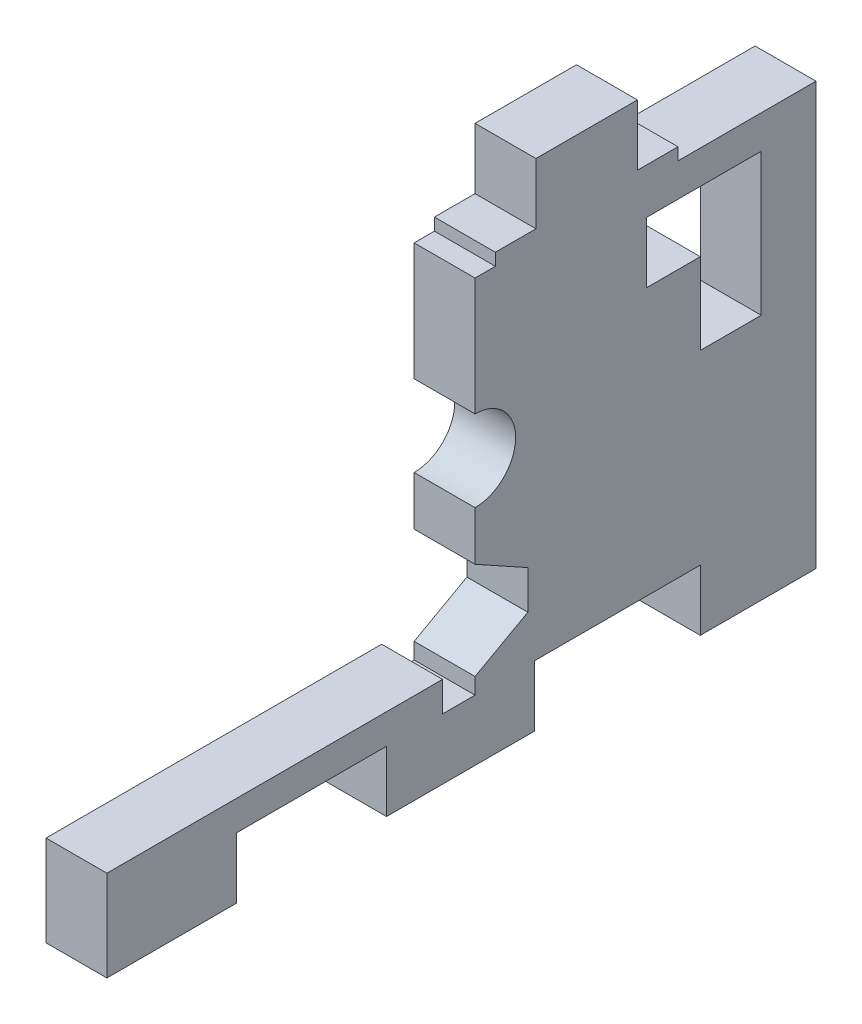
ISO-10303-21;
HEADER;
FILE_DESCRIPTION(('STEP AP214'),'2;1');
FILE_NAME('part.step','',(''),(''),'','','');
FILE_SCHEMA(('AUTOMOTIVE_DESIGN { 1 0 10303 214 1 1 1 1 }'));
ENDSEC;
DATA;
#1=APPLICATION_CONTEXT('core data for automotive mechanical design processes');
#2=APPLICATION_PROTOCOL_DEFINITION('international standard','automotive_design',2000,#1);
#3=PRODUCT_CONTEXT('',#1,'mechanical');
#4=PRODUCT('Part','Part','',(#3));
#5=PRODUCT_RELATED_PRODUCT_CATEGORY('part','',(#4));
#6=PRODUCT_DEFINITION_FORMATION('','',#4);
#7=PRODUCT_DEFINITION_CONTEXT('part definition',#1,'design');
#8=PRODUCT_DEFINITION('design','',#6,#7);
#9=PRODUCT_DEFINITION_SHAPE('','',#8);
#10=(LENGTH_UNIT() NAMED_UNIT(*) SI_UNIT(.MILLI.,.METRE.));
#11=(NAMED_UNIT(*) PLANE_ANGLE_UNIT() SI_UNIT($,.RADIAN.));
#12=(NAMED_UNIT(*) SI_UNIT($,.STERADIAN.) SOLID_ANGLE_UNIT());
#13=UNCERTAINTY_MEASURE_WITH_UNIT(LENGTH_MEASURE(1.E-05),#10,'distance_accuracy_value','');
#14=(GEOMETRIC_REPRESENTATION_CONTEXT(3) GLOBAL_UNCERTAINTY_ASSIGNED_CONTEXT((#13)) GLOBAL_UNIT_ASSIGNED_CONTEXT((#10,
#11,#12)) REPRESENTATION_CONTEXT('',''));
#15=CARTESIAN_POINT('',(0.,0.,0.));
#16=DIRECTION('',(0.,0.,1.));
#17=DIRECTION('',(1.,0.,0.));
#18=AXIS2_PLACEMENT_3D('',#15,#16,#17);
#19=CARTESIAN_POINT('',(64.56,17.8,-16.8));
#20=DIRECTION('',(0.,1.,0.));
#21=DIRECTION('',(0.,0.,1.));
#22=AXIS2_PLACEMENT_3D('',#19,#20,#21);
#23=PLANE('',#22);
#24=DIRECTION('',(0.,0.,-1.));
#25=VECTOR('',#24,1.);
#26=CARTESIAN_POINT('',(61.56,17.8,-16.8));
#27=LINE('',#26,#25);
#28=CARTESIAN_POINT('',(61.56,17.8,-10.));
#29=VERTEX_POINT('',#28);
#30=CARTESIAN_POINT('',(61.56,17.8,-16.8));
#31=VERTEX_POINT('',#30);
#32=EDGE_CURVE('E56',#29,#31,#27,.T.);
#33=ORIENTED_EDGE('',*,*,#32,.F.);
#34=DIRECTION('',(1.,0.,0.));
#35=VECTOR('',#34,1.);
#36=CARTESIAN_POINT('',(51.8667033471579,17.8,-10.));
#37=LINE('',#36,#35);
#38=CARTESIAN_POINT('',(64.56,17.8,-10.));
#39=VERTEX_POINT('',#38);
#40=EDGE_CURVE('E51',#29,#39,#37,.T.);
#41=ORIENTED_EDGE('',*,*,#40,.T.);
#42=DIRECTION('',(0.,0.,-1.));
#43=VECTOR('',#42,1.);
#44=CARTESIAN_POINT('',(64.56,17.8,-16.8));
#45=LINE('',#44,#43);
#46=CARTESIAN_POINT('',(64.56,17.8,-16.8));
#47=VERTEX_POINT('',#46);
#48=EDGE_CURVE('E453',#39,#47,#45,.T.);
#49=ORIENTED_EDGE('',*,*,#48,.T.);
#50=DIRECTION('',(-1.,0.,0.));
#51=VECTOR('',#50,1.);
#52=CARTESIAN_POINT('',(64.56,17.8,-16.8));
#53=LINE('',#52,#51);
#54=EDGE_CURVE('E43',#47,#31,#53,.T.);
#55=ORIENTED_EDGE('',*,*,#54,.T.);
#56=EDGE_LOOP('',(#33,#41,#49,#55));
#57=FACE_BOUND('',#56,.T.);
#58=ADVANCED_FACE('F34',(#57),#23,.T.);
#59=CARTESIAN_POINT('',(64.56,17.8,0.));
#60=DIRECTION('',(0.,0.,1.));
#61=DIRECTION('',(0.,-1.,0.));
#62=AXIS2_PLACEMENT_3D('',#59,#60,#61);
#63=PLANE('',#62);
#64=DIRECTION('',(-1.,0.,0.));
#65=VECTOR('',#64,1.);
#66=CARTESIAN_POINT('',(86.894686100132,0.79664593212668,0.));
#67=LINE('',#66,#65);
#68=CARTESIAN_POINT('',(64.56,0.79664593212668,0.));
#69=VERTEX_POINT('',#68);
#70=CARTESIAN_POINT('',(61.56,0.79664593212668,0.));
#71=VERTEX_POINT('',#70);
#72=EDGE_CURVE('E510',#69,#71,#67,.T.);
#73=ORIENTED_EDGE('',*,*,#72,.T.);
#74=DIRECTION('',(0.,1.,0.));
#75=VECTOR('',#74,1.);
#76=CARTESIAN_POINT('',(61.56,17.8,0.));
#77=LINE('',#76,#75);
#78=CARTESIAN_POINT('',(61.56,0.,0.));
#79=VERTEX_POINT('',#78);
#80=EDGE_CURVE('E410',#79,#71,#77,.T.);
#81=ORIENTED_EDGE('',*,*,#80,.F.);
#82=DIRECTION('',(-1.,0.,0.));
#83=VECTOR('',#82,1.);
#84=CARTESIAN_POINT('',(64.56,0.,0.));
#85=LINE('',#84,#83);
#86=CARTESIAN_POINT('',(64.56,0.,0.));
#87=VERTEX_POINT('',#86);
#88=EDGE_CURVE('E423',#87,#79,#85,.T.);
#89=ORIENTED_EDGE('',*,*,#88,.F.);
#90=DIRECTION('',(0.,1.,0.));
#91=VECTOR('',#90,1.);
#92=CARTESIAN_POINT('',(64.56,17.8,0.));
#93=LINE('',#92,#91);
#94=EDGE_CURVE('E454',#87,#69,#93,.T.);
#95=ORIENTED_EDGE('',*,*,#94,.T.);
#96=EDGE_LOOP('',(#73,#81,#89,#95));
#97=FACE_BOUND('',#96,.T.);
#98=ADVANCED_FACE('F507',(#97),#63,.T.);
#99=DIRECTION('',(-1.,0.,0.));
#100=VECTOR('',#99,1.);
#101=CARTESIAN_POINT('',(86.894686100132,12.,0.));
#102=LINE('',#101,#100);
#103=CARTESIAN_POINT('',(64.56,12.,0.));
#104=VERTEX_POINT('',#103);
#105=CARTESIAN_POINT('',(61.56,12.,0.));
#106=VERTEX_POINT('',#105);
#107=EDGE_CURVE('E537',#104,#106,#102,.T.);
#108=ORIENTED_EDGE('',*,*,#107,.F.);
#109=CARTESIAN_POINT('',(64.56,17.8,0.));
#110=VERTEX_POINT('',#109);
#111=EDGE_CURVE('E581',#104,#110,#93,.T.);
#112=ORIENTED_EDGE('',*,*,#111,.T.);
#113=DIRECTION('',(-1.,0.,0.));
#114=VECTOR('',#113,1.);
#115=CARTESIAN_POINT('',(64.56,17.8,0.));
#116=LINE('',#115,#114);
#117=CARTESIAN_POINT('',(61.56,17.8,0.));
#118=VERTEX_POINT('',#117);
#119=EDGE_CURVE('E421',#110,#118,#116,.T.);
#120=ORIENTED_EDGE('',*,*,#119,.T.);
#121=EDGE_CURVE('E404',#106,#118,#77,.T.);
#122=ORIENTED_EDGE('',*,*,#121,.F.);
#123=EDGE_LOOP('',(#108,#112,#120,#122));
#124=FACE_BOUND('',#123,.T.);
#125=ADVANCED_FACE('F599',(#124),#63,.T.);
#126=CARTESIAN_POINT('',(64.56,0.,-16.8));
#127=DIRECTION('',(0.,0.,-1.));
#128=DIRECTION('',(-1.,0.,0.));
#129=AXIS2_PLACEMENT_3D('',#126,#127,#128);
#130=PLANE('',#129);
#131=DIRECTION('',(0.,-1.,0.));
#132=VECTOR('',#131,1.);
#133=CARTESIAN_POINT('',(61.56,0.,-16.8));
#134=LINE('',#133,#132);
#135=CARTESIAN_POINT('',(61.56,-3.,-16.8));
#136=VERTEX_POINT('',#135);
#137=EDGE_CURVE('E406',#31,#136,#134,.T.);
#138=ORIENTED_EDGE('',*,*,#137,.F.);
#139=ORIENTED_EDGE('',*,*,#54,.F.);
#140=DIRECTION('',(0.,-1.,0.));
#141=VECTOR('',#140,1.);
#142=CARTESIAN_POINT('',(64.56,-3.,-16.8));
#143=LINE('',#142,#141);
#144=CARTESIAN_POINT('',(64.56,-3.,-16.8));
#145=VERTEX_POINT('',#144);
#146=EDGE_CURVE('E408',#47,#145,#143,.T.);
#147=ORIENTED_EDGE('',*,*,#146,.T.);
#148=DIRECTION('',(-1.,0.,0.));
#149=VECTOR('',#148,1.);
#150=CARTESIAN_POINT('',(64.56,-3.,-16.8));
#151=LINE('',#150,#149);
#152=EDGE_CURVE('E448',#145,#136,#151,.T.);
#153=ORIENTED_EDGE('',*,*,#152,.T.);
#154=EDGE_LOOP('',(#138,#139,#147,#153));
#155=FACE_BOUND('',#154,.T.);
#156=ADVANCED_FACE('F601',(#155),#130,.T.);
#157=DIRECTION('',(1.,0.,0.));
#158=VECTOR('',#157,1.);
#159=CARTESIAN_POINT('',(51.8667033471579,17.8,-1.));
#160=LINE('',#159,#158);
#161=CARTESIAN_POINT('',(61.56,17.8,-1.));
#162=VERTEX_POINT('',#161);
#163=CARTESIAN_POINT('',(64.56,17.8,-1.));
#164=VERTEX_POINT('',#163);
#165=EDGE_CURVE('E336',#162,#164,#160,.T.);
#166=ORIENTED_EDGE('',*,*,#165,.F.);
#167=EDGE_CURVE('E400',#118,#162,#27,.T.);
#168=ORIENTED_EDGE('',*,*,#167,.F.);
#169=ORIENTED_EDGE('',*,*,#119,.F.);
#170=EDGE_CURVE('E401',#110,#164,#45,.T.);
#171=ORIENTED_EDGE('',*,*,#170,.T.);
#172=EDGE_LOOP('',(#166,#168,#169,#171));
#173=FACE_BOUND('',#172,.T.);
#174=ADVANCED_FACE('F398',(#173),#23,.T.);
#175=DIRECTION('',(-1.,0.,0.));
#176=VECTOR('',#175,1.);
#177=CARTESIAN_POINT('',(86.894686100132,5.58335406787332,0.));
#178=LINE('',#177,#176);
#179=CARTESIAN_POINT('',(64.56,5.58335406787332,0.));
#180=VERTEX_POINT('',#179);
#181=CARTESIAN_POINT('',(61.56,5.58335406787333,0.));
#182=VERTEX_POINT('',#181);
#183=EDGE_CURVE('E522',#180,#182,#178,.T.);
#184=ORIENTED_EDGE('',*,*,#183,.F.);
#185=CARTESIAN_POINT('',(64.56,8.,0.));
#186=VERTEX_POINT('',#185);
#187=EDGE_CURVE('E584',#180,#186,#93,.T.);
#188=ORIENTED_EDGE('',*,*,#187,.T.);
#189=DIRECTION('',(-1.,0.,0.));
#190=VECTOR('',#189,1.);
#191=CARTESIAN_POINT('',(86.894686100132,8.,0.));
#192=LINE('',#191,#190);
#193=CARTESIAN_POINT('',(61.56,8.,0.));
#194=VERTEX_POINT('',#193);
#195=EDGE_CURVE('E538',#186,#194,#192,.T.);
#196=ORIENTED_EDGE('',*,*,#195,.T.);
#197=EDGE_CURVE('E500',#182,#194,#77,.T.);
#198=ORIENTED_EDGE('',*,*,#197,.F.);
#199=EDGE_LOOP('',(#184,#188,#196,#198));
#200=FACE_BOUND('',#199,.T.);
#201=ADVANCED_FACE('F592',(#200),#63,.T.);
#202=CARTESIAN_POINT('',(64.56,0.,1.6));
#203=DIRECTION('',(0.,1.,0.));
#204=DIRECTION('',(0.,0.,1.));
#205=AXIS2_PLACEMENT_3D('',#202,#203,#204);
#206=PLANE('',#205);
#207=DIRECTION('',(0.,0.,-1.));
#208=VECTOR('',#207,1.);
#209=CARTESIAN_POINT('',(61.56,0.,1.6));
#210=LINE('',#209,#208);
#211=CARTESIAN_POINT('',(61.56,0.,1.6));
#212=VERTEX_POINT('',#211);
#213=EDGE_CURVE('E497',#212,#79,#210,.T.);
#214=ORIENTED_EDGE('',*,*,#213,.F.);
#215=DIRECTION('',(-1.,0.,0.));
#216=VECTOR('',#215,1.);
#217=CARTESIAN_POINT('',(64.56,0.,1.6));
#218=LINE('',#217,#216);
#219=CARTESIAN_POINT('',(64.56,0.,1.6));
#220=VERTEX_POINT('',#219);
#221=EDGE_CURVE('E425',#220,#212,#218,.T.);
#222=ORIENTED_EDGE('',*,*,#221,.F.);
#223=DIRECTION('',(0.,0.,-1.));
#224=VECTOR('',#223,1.);
#225=CARTESIAN_POINT('',(64.56,0.,1.6));
#226=LINE('',#225,#224);
#227=EDGE_CURVE('E579',#220,#87,#226,.T.);
#228=ORIENTED_EDGE('',*,*,#227,.T.);
#229=ORIENTED_EDGE('',*,*,#88,.T.);
#230=EDGE_LOOP('',(#214,#222,#228,#229));
#231=FACE_BOUND('',#230,.T.);
#232=ADVANCED_FACE('F611',(#231),#206,.T.);
#233=CARTESIAN_POINT('',(64.56,0.,1.6));
#234=DIRECTION('',(0.,0.,-1.));
#235=DIRECTION('',(-1.,0.,0.));
#236=AXIS2_PLACEMENT_3D('',#233,#234,#235);
#237=PLANE('',#236);
#238=DIRECTION('',(0.,-1.,0.));
#239=VECTOR('',#238,1.);
#240=CARTESIAN_POINT('',(61.56,0.,1.6));
#241=LINE('',#240,#239);
#242=CARTESIAN_POINT('',(61.56,1.47320456773059,1.6));
#243=VERTEX_POINT('',#242);
#244=EDGE_CURVE('E495',#243,#212,#241,.T.);
#245=ORIENTED_EDGE('',*,*,#244,.F.);
#246=DIRECTION('',(-1.,0.,0.));
#247=VECTOR('',#246,1.);
#248=CARTESIAN_POINT('',(64.56,1.47320456773059,1.6));
#249=LINE('',#248,#247);
#250=CARTESIAN_POINT('',(64.56,1.47320456773059,1.6));
#251=VERTEX_POINT('',#250);
#252=EDGE_CURVE('E427',#251,#243,#249,.T.);
#253=ORIENTED_EDGE('',*,*,#252,.F.);
#254=DIRECTION('',(0.,-1.,0.));
#255=VECTOR('',#254,1.);
#256=CARTESIAN_POINT('',(64.56,0.,1.6));
#257=LINE('',#256,#255);
#258=EDGE_CURVE('E577',#251,#220,#257,.T.);
#259=ORIENTED_EDGE('',*,*,#258,.T.);
#260=ORIENTED_EDGE('',*,*,#221,.T.);
#261=EDGE_LOOP('',(#245,#253,#259,#260));
#262=FACE_BOUND('',#261,.T.);
#263=ADVANCED_FACE('F632',(#262),#237,.T.);
#264=CARTESIAN_POINT('',(64.56,1.47320456773059,1.6));
#265=DIRECTION('',(0.,1.,0.));
#266=DIRECTION('',(0.,0.,1.));
#267=AXIS2_PLACEMENT_3D('',#264,#265,#266);
#268=PLANE('',#267);
#269=DIRECTION('',(0.,0.,-1.));
#270=VECTOR('',#269,1.);
#271=CARTESIAN_POINT('',(61.56,1.47320456773059,1.6));
#272=LINE('',#271,#270);
#273=CARTESIAN_POINT('',(61.56,1.47320456773059,18.14));
#274=VERTEX_POINT('',#273);
#275=EDGE_CURVE('E492',#274,#243,#272,.T.);
#276=ORIENTED_EDGE('',*,*,#275,.F.);
#277=DIRECTION('',(-1.,0.,0.));
#278=VECTOR('',#277,1.);
#279=CARTESIAN_POINT('',(64.56,1.47320456773059,18.14));
#280=LINE('',#279,#278);
#281=CARTESIAN_POINT('',(64.56,1.47320456773059,18.14));
#282=VERTEX_POINT('',#281);
#283=EDGE_CURVE('E429',#282,#274,#280,.T.);
#284=ORIENTED_EDGE('',*,*,#283,.F.);
#285=DIRECTION('',(0.,0.,-1.));
#286=VECTOR('',#285,1.);
#287=CARTESIAN_POINT('',(64.56,1.47320456773059,1.6));
#288=LINE('',#287,#286);
#289=EDGE_CURVE('E574',#282,#251,#288,.T.);
#290=ORIENTED_EDGE('',*,*,#289,.T.);
#291=ORIENTED_EDGE('',*,*,#252,.T.);
#292=EDGE_LOOP('',(#276,#284,#290,#291));
#293=FACE_BOUND('',#292,.T.);
#294=ADVANCED_FACE('F639',(#293),#268,.T.);
#295=CARTESIAN_POINT('',(64.56,1.47320456773059,18.14));
#296=DIRECTION('',(0.,0.,1.));
#297=DIRECTION('',(1.,0.,0.));
#298=AXIS2_PLACEMENT_3D('',#295,#296,#297);
#299=PLANE('',#298);
#300=DIRECTION('',(0.,1.,0.));
#301=VECTOR('',#300,1.);
#302=CARTESIAN_POINT('',(61.56,1.47320456773059,18.14));
#303=LINE('',#302,#301);
#304=CARTESIAN_POINT('',(61.56,-3.,18.14));
#305=VERTEX_POINT('',#304);
#306=EDGE_CURVE('E489',#305,#274,#303,.T.);
#307=ORIENTED_EDGE('',*,*,#306,.F.);
#308=DIRECTION('',(-1.,0.,0.));
#309=VECTOR('',#308,1.);
#310=CARTESIAN_POINT('',(64.56,-3.,18.14));
#311=LINE('',#310,#309);
#312=CARTESIAN_POINT('',(64.56,-3.,18.14));
#313=VERTEX_POINT('',#312);
#314=EDGE_CURVE('E431',#313,#305,#311,.T.);
#315=ORIENTED_EDGE('',*,*,#314,.F.);
#316=DIRECTION('',(0.,1.,0.));
#317=VECTOR('',#316,1.);
#318=CARTESIAN_POINT('',(64.56,1.47320456773059,18.14));
#319=LINE('',#318,#317);
#320=EDGE_CURVE('E571',#313,#282,#319,.T.);
#321=ORIENTED_EDGE('',*,*,#320,.T.);
#322=ORIENTED_EDGE('',*,*,#283,.T.);
#323=EDGE_LOOP('',(#307,#315,#321,#322));
#324=FACE_BOUND('',#323,.T.);
#325=ADVANCED_FACE('F648',(#324),#299,.T.);
#326=CARTESIAN_POINT('',(64.56,-3.,18.14));
#327=DIRECTION('',(0.,-1.,0.));
#328=DIRECTION('',(0.,0.,-1.));
#329=AXIS2_PLACEMENT_3D('',#326,#327,#328);
#330=PLANE('',#329);
#331=DIRECTION('',(0.,0.,1.));
#332=VECTOR('',#331,1.);
#333=CARTESIAN_POINT('',(61.56,-3.,18.14));
#334=LINE('',#333,#332);
#335=CARTESIAN_POINT('',(61.56,-3.,11.7632323222878));
#336=VERTEX_POINT('',#335);
#337=EDGE_CURVE('E486',#336,#305,#334,.T.);
#338=ORIENTED_EDGE('',*,*,#337,.F.);
#339=DIRECTION('',(-1.,0.,0.));
#340=VECTOR('',#339,1.);
#341=CARTESIAN_POINT('',(64.56,-3.,11.7632323222878));
#342=LINE('',#341,#340);
#343=CARTESIAN_POINT('',(64.56,-3.,11.7632323222878));
#344=VERTEX_POINT('',#343);
#345=EDGE_CURVE('E433',#344,#336,#342,.T.);
#346=ORIENTED_EDGE('',*,*,#345,.F.);
#347=DIRECTION('',(0.,0.,1.));
#348=VECTOR('',#347,1.);
#349=CARTESIAN_POINT('',(64.56,-3.,18.14));
#350=LINE('',#349,#348);
#351=EDGE_CURVE('E568',#344,#313,#350,.T.);
#352=ORIENTED_EDGE('',*,*,#351,.T.);
#353=ORIENTED_EDGE('',*,*,#314,.T.);
#354=EDGE_LOOP('',(#338,#346,#352,#353));
#355=FACE_BOUND('',#354,.T.);
#356=ADVANCED_FACE('F657',(#355),#330,.T.);
#357=CARTESIAN_POINT('',(64.56,0.,11.7632323222878));
#358=DIRECTION('',(0.,0.,-1.));
#359=DIRECTION('',(-1.,0.,0.));
#360=AXIS2_PLACEMENT_3D('',#357,#358,#359);
#361=PLANE('',#360);
#362=DIRECTION('',(0.,-1.,0.));
#363=VECTOR('',#362,1.);
#364=CARTESIAN_POINT('',(61.56,0.,11.7632323222878));
#365=LINE('',#364,#363);
#366=CARTESIAN_POINT('',(61.56,0.,11.7632323222878));
#367=VERTEX_POINT('',#366);
#368=EDGE_CURVE('E483',#367,#336,#365,.T.);
#369=ORIENTED_EDGE('',*,*,#368,.F.);
#370=DIRECTION('',(-1.,0.,0.));
#371=VECTOR('',#370,1.);
#372=CARTESIAN_POINT('',(64.56,0.,11.7632323222878));
#373=LINE('',#372,#371);
#374=CARTESIAN_POINT('',(64.56,0.,11.7632323222878));
#375=VERTEX_POINT('',#374);
#376=EDGE_CURVE('E435',#375,#367,#373,.T.);
#377=ORIENTED_EDGE('',*,*,#376,.F.);
#378=DIRECTION('',(0.,-1.,0.));
#379=VECTOR('',#378,1.);
#380=CARTESIAN_POINT('',(64.56,0.,11.7632323222878));
#381=LINE('',#380,#379);
#382=EDGE_CURVE('E565',#375,#344,#381,.T.);
#383=ORIENTED_EDGE('',*,*,#382,.T.);
#384=ORIENTED_EDGE('',*,*,#345,.T.);
#385=EDGE_LOOP('',(#369,#377,#383,#384));
#386=FACE_BOUND('',#385,.T.);
#387=ADVANCED_FACE('F666',(#386),#361,.T.);
#388=CARTESIAN_POINT('',(64.56,0.,4.36122596810407));
#389=DIRECTION('',(0.,-1.,0.));
#390=DIRECTION('',(0.,0.,-1.));
#391=AXIS2_PLACEMENT_3D('',#388,#389,#390);
#392=PLANE('',#391);
#393=DIRECTION('',(0.,0.,1.));
#394=VECTOR('',#393,1.);
#395=CARTESIAN_POINT('',(61.56,0.,4.36122596810407));
#396=LINE('',#395,#394);
#397=CARTESIAN_POINT('',(61.56,0.,4.36122596810407));
#398=VERTEX_POINT('',#397);
#399=EDGE_CURVE('E480',#398,#367,#396,.T.);
#400=ORIENTED_EDGE('',*,*,#399,.F.);
#401=DIRECTION('',(-1.,0.,0.));
#402=VECTOR('',#401,1.);
#403=CARTESIAN_POINT('',(64.56,0.,4.36122596810407));
#404=LINE('',#403,#402);
#405=CARTESIAN_POINT('',(64.56,0.,4.36122596810407));
#406=VERTEX_POINT('',#405);
#407=EDGE_CURVE('E437',#406,#398,#404,.T.);
#408=ORIENTED_EDGE('',*,*,#407,.F.);
#409=DIRECTION('',(0.,0.,1.));
#410=VECTOR('',#409,1.);
#411=CARTESIAN_POINT('',(64.56,0.,4.36122596810407));
#412=LINE('',#411,#410);
#413=EDGE_CURVE('E562',#406,#375,#412,.T.);
#414=ORIENTED_EDGE('',*,*,#413,.T.);
#415=ORIENTED_EDGE('',*,*,#376,.T.);
#416=EDGE_LOOP('',(#400,#408,#414,#415));
#417=FACE_BOUND('',#416,.T.);
#418=ADVANCED_FACE('F675',(#417),#392,.T.);
#419=CARTESIAN_POINT('',(64.56,-3.,4.36122596810407));
#420=DIRECTION('',(0.,0.,1.));
#421=DIRECTION('',(1.,0.,0.));
#422=AXIS2_PLACEMENT_3D('',#419,#420,#421);
#423=PLANE('',#422);
#424=DIRECTION('',(0.,1.,0.));
#425=VECTOR('',#424,1.);
#426=CARTESIAN_POINT('',(61.56,-3.,4.36122596810407));
#427=LINE('',#426,#425);
#428=CARTESIAN_POINT('',(61.56,-3.,4.36122596810407));
#429=VERTEX_POINT('',#428);
#430=EDGE_CURVE('E477',#429,#398,#427,.T.);
#431=ORIENTED_EDGE('',*,*,#430,.F.);
#432=DIRECTION('',(-1.,0.,0.));
#433=VECTOR('',#432,1.);
#434=CARTESIAN_POINT('',(64.56,-3.,4.36122596810407));
#435=LINE('',#434,#433);
#436=CARTESIAN_POINT('',(64.56,-3.,4.36122596810407));
#437=VERTEX_POINT('',#436);
#438=EDGE_CURVE('E439',#437,#429,#435,.T.);
#439=ORIENTED_EDGE('',*,*,#438,.F.);
#440=DIRECTION('',(0.,1.,0.));
#441=VECTOR('',#440,1.);
#442=CARTESIAN_POINT('',(64.56,-3.,4.36122596810407));
#443=LINE('',#442,#441);
#444=EDGE_CURVE('E559',#437,#406,#443,.T.);
#445=ORIENTED_EDGE('',*,*,#444,.T.);
#446=ORIENTED_EDGE('',*,*,#407,.T.);
#447=EDGE_LOOP('',(#431,#439,#445,#446));
#448=FACE_BOUND('',#447,.T.);
#449=ADVANCED_FACE('F684',(#448),#423,.T.);
#450=CARTESIAN_POINT('',(64.56,-3.,4.36122596810407));
#451=DIRECTION('',(0.,-1.,0.));
#452=DIRECTION('',(0.,0.,-1.));
#453=AXIS2_PLACEMENT_3D('',#450,#451,#452);
#454=PLANE('',#453);
#455=DIRECTION('',(0.,0.,1.));
#456=VECTOR('',#455,1.);
#457=CARTESIAN_POINT('',(61.56,-3.,4.36122596810407));
#458=LINE('',#457,#456);
#459=CARTESIAN_POINT('',(61.56,-3.,-2.93914258243433));
#460=VERTEX_POINT('',#459);
#461=EDGE_CURVE('E474',#460,#429,#458,.T.);
#462=ORIENTED_EDGE('',*,*,#461,.F.);
#463=DIRECTION('',(-1.,0.,0.));
#464=VECTOR('',#463,1.);
#465=CARTESIAN_POINT('',(64.56,-3.,-2.93914258243433));
#466=LINE('',#465,#464);
#467=CARTESIAN_POINT('',(64.56,-3.,-2.93914258243433));
#468=VERTEX_POINT('',#467);
#469=EDGE_CURVE('E441',#468,#460,#466,.T.);
#470=ORIENTED_EDGE('',*,*,#469,.F.);
#471=DIRECTION('',(0.,0.,1.));
#472=VECTOR('',#471,1.);
#473=CARTESIAN_POINT('',(64.56,-3.,4.36122596810407));
#474=LINE('',#473,#472);
#475=EDGE_CURVE('E556',#468,#437,#474,.T.);
#476=ORIENTED_EDGE('',*,*,#475,.T.);
#477=ORIENTED_EDGE('',*,*,#438,.T.);
#478=EDGE_LOOP('',(#462,#470,#476,#477));
#479=FACE_BOUND('',#478,.T.);
#480=ADVANCED_FACE('F693',(#479),#454,.T.);
#481=CARTESIAN_POINT('',(64.56,0.,-2.93914258243433));
#482=DIRECTION('',(0.,0.,-1.));
#483=DIRECTION('',(-1.,0.,0.));
#484=AXIS2_PLACEMENT_3D('',#481,#482,#483);
#485=PLANE('',#484);
#486=DIRECTION('',(0.,-1.,0.));
#487=VECTOR('',#486,1.);
#488=CARTESIAN_POINT('',(61.56,0.,-2.93914258243433));
#489=LINE('',#488,#487);
#490=CARTESIAN_POINT('',(61.56,0.,-2.93914258243433));
#491=VERTEX_POINT('',#490);
#492=EDGE_CURVE('E471',#491,#460,#489,.T.);
#493=ORIENTED_EDGE('',*,*,#492,.F.);
#494=DIRECTION('',(-1.,0.,0.));
#495=VECTOR('',#494,1.);
#496=CARTESIAN_POINT('',(64.56,0.,-2.93914258243433));
#497=LINE('',#496,#495);
#498=CARTESIAN_POINT('',(64.56,0.,-2.93914258243433));
#499=VERTEX_POINT('',#498);
#500=EDGE_CURVE('E443',#499,#491,#497,.T.);
#501=ORIENTED_EDGE('',*,*,#500,.F.);
#502=DIRECTION('',(0.,-1.,0.));
#503=VECTOR('',#502,1.);
#504=CARTESIAN_POINT('',(64.56,0.,-2.93914258243433));
#505=LINE('',#504,#503);
#506=EDGE_CURVE('E553',#499,#468,#505,.T.);
#507=ORIENTED_EDGE('',*,*,#506,.T.);
#508=ORIENTED_EDGE('',*,*,#469,.T.);
#509=EDGE_LOOP('',(#493,#501,#507,#508));
#510=FACE_BOUND('',#509,.T.);
#511=ADVANCED_FACE('F702',(#510),#485,.T.);
#512=CARTESIAN_POINT('',(64.56,0.,-11.1));
#513=DIRECTION('',(0.,-1.,0.));
#514=DIRECTION('',(0.,0.,-1.));
#515=AXIS2_PLACEMENT_3D('',#512,#513,#514);
#516=PLANE('',#515);
#517=DIRECTION('',(0.,0.,1.));
#518=VECTOR('',#517,1.);
#519=CARTESIAN_POINT('',(61.56,0.,-11.1));
#520=LINE('',#519,#518);
#521=CARTESIAN_POINT('',(61.56,0.,-11.1));
#522=VERTEX_POINT('',#521);
#523=EDGE_CURVE('E468',#522,#491,#520,.T.);
#524=ORIENTED_EDGE('',*,*,#523,.F.);
#525=DIRECTION('',(-1.,0.,0.));
#526=VECTOR('',#525,1.);
#527=CARTESIAN_POINT('',(64.56,0.,-11.1));
#528=LINE('',#527,#526);
#529=CARTESIAN_POINT('',(64.56,0.,-11.1));
#530=VERTEX_POINT('',#529);
#531=EDGE_CURVE('E445',#530,#522,#528,.T.);
#532=ORIENTED_EDGE('',*,*,#531,.F.);
#533=DIRECTION('',(0.,0.,1.));
#534=VECTOR('',#533,1.);
#535=CARTESIAN_POINT('',(64.56,0.,-11.1));
#536=LINE('',#535,#534);
#537=EDGE_CURVE('E550',#530,#499,#536,.T.);
#538=ORIENTED_EDGE('',*,*,#537,.T.);
#539=ORIENTED_EDGE('',*,*,#500,.T.);
#540=EDGE_LOOP('',(#524,#532,#538,#539));
#541=FACE_BOUND('',#540,.T.);
#542=ADVANCED_FACE('F711',(#541),#516,.T.);
#543=CARTESIAN_POINT('',(64.56,-3.,-11.1));
#544=DIRECTION('',(0.,0.,1.));
#545=DIRECTION('',(0.,-1.,0.));
#546=AXIS2_PLACEMENT_3D('',#543,#544,#545);
#547=PLANE('',#546);
#548=DIRECTION('',(0.,1.,0.));
#549=VECTOR('',#548,1.);
#550=CARTESIAN_POINT('',(61.56,-3.,-11.1));
#551=LINE('',#550,#549);
#552=CARTESIAN_POINT('',(61.56,-3.,-11.1));
#553=VERTEX_POINT('',#552);
#554=EDGE_CURVE('E464',#553,#522,#551,.T.);
#555=ORIENTED_EDGE('',*,*,#554,.F.);
#556=DIRECTION('',(-1.,0.,0.));
#557=VECTOR('',#556,1.);
#558=CARTESIAN_POINT('',(64.56,-3.,-11.1));
#559=LINE('',#558,#557);
#560=CARTESIAN_POINT('',(64.56,-3.,-11.1));
#561=VERTEX_POINT('',#560);
#562=EDGE_CURVE('E447',#561,#553,#559,.T.);
#563=ORIENTED_EDGE('',*,*,#562,.F.);
#564=DIRECTION('',(0.,1.,0.));
#565=VECTOR('',#564,1.);
#566=CARTESIAN_POINT('',(64.56,-3.,-11.1));
#567=LINE('',#566,#565);
#568=EDGE_CURVE('E547',#561,#530,#567,.T.);
#569=ORIENTED_EDGE('',*,*,#568,.T.);
#570=ORIENTED_EDGE('',*,*,#531,.T.);
#571=EDGE_LOOP('',(#555,#563,#569,#570));
#572=FACE_BOUND('',#571,.T.);
#573=ADVANCED_FACE('F720',(#572),#547,.T.);
#574=CARTESIAN_POINT('',(64.56,-3.,-11.1));
#575=DIRECTION('',(0.,-1.,0.));
#576=DIRECTION('',(0.,0.,-1.));
#577=AXIS2_PLACEMENT_3D('',#574,#575,#576);
#578=PLANE('',#577);
#579=DIRECTION('',(0.,0.,1.));
#580=VECTOR('',#579,1.);
#581=CARTESIAN_POINT('',(61.56,-3.,-11.1));
#582=LINE('',#581,#580);
#583=EDGE_CURVE('E460',#136,#553,#582,.T.);
#584=ORIENTED_EDGE('',*,*,#583,.F.);
#585=ORIENTED_EDGE('',*,*,#152,.F.);
#586=DIRECTION('',(0.,0.,1.));
#587=VECTOR('',#586,1.);
#588=CARTESIAN_POINT('',(64.56,-3.,-11.1));
#589=LINE('',#588,#587);
#590=EDGE_CURVE('E544',#145,#561,#589,.T.);
#591=ORIENTED_EDGE('',*,*,#590,.T.);
#592=ORIENTED_EDGE('',*,*,#562,.T.);
#593=EDGE_LOOP('',(#584,#585,#591,#592));
#594=FACE_BOUND('',#593,.T.);
#595=ADVANCED_FACE('F36',(#594),#578,.T.);
#596=CARTESIAN_POINT('',(64.56,0.,0.));
#597=DIRECTION('',(1.,0.,0.));
#598=DIRECTION('',(0.,0.,-1.));
#599=AXIS2_PLACEMENT_3D('',#596,#597,#598);
#600=PLANE('',#599);
#601=DIRECTION('',(0.,-1.,0.));
#602=VECTOR('',#601,1.);
#603=CARTESIAN_POINT('',(64.56,16.16,-8.448216521316));
#604=LINE('',#603,#602);
#605=CARTESIAN_POINT('',(64.56,16.16,-8.448216521316));
#606=VERTEX_POINT('',#605);
#607=CARTESIAN_POINT('',(64.56,13.16,-8.448216521316));
#608=VERTEX_POINT('',#607);
#609=EDGE_CURVE('E962',#606,#608,#604,.T.);
#610=ORIENTED_EDGE('',*,*,#609,.F.);
#611=DIRECTION('',(0.,0.,1.));
#612=VECTOR('',#611,1.);
#613=CARTESIAN_POINT('',(64.56,16.16,-14.1));
#614=LINE('',#613,#612);
#615=CARTESIAN_POINT('',(64.56,16.16,-14.1));
#616=VERTEX_POINT('',#615);
#617=EDGE_CURVE('E282',#616,#606,#614,.T.);
#618=ORIENTED_EDGE('',*,*,#617,.F.);
#619=DIRECTION('',(0.,1.,0.));
#620=VECTOR('',#619,1.);
#621=CARTESIAN_POINT('',(64.56,9.16000000000001,-14.1));
#622=LINE('',#621,#620);
#623=CARTESIAN_POINT('',(64.56,9.16000000000001,-14.1));
#624=VERTEX_POINT('',#623);
#625=EDGE_CURVE('E976',#624,#616,#622,.T.);
#626=ORIENTED_EDGE('',*,*,#625,.F.);
#627=DIRECTION('',(0.,0.,-1.));
#628=VECTOR('',#627,1.);
#629=CARTESIAN_POINT('',(64.56,9.16000000000001,-11.1));
#630=LINE('',#629,#628);
#631=CARTESIAN_POINT('',(64.56,9.16000000000001,-11.1));
#632=VERTEX_POINT('',#631);
#633=EDGE_CURVE('E974',#632,#624,#630,.T.);
#634=ORIENTED_EDGE('',*,*,#633,.F.);
#635=DIRECTION('',(0.,-1.,0.));
#636=VECTOR('',#635,1.);
#637=CARTESIAN_POINT('',(64.56,13.16,-11.1));
#638=LINE('',#637,#636);
#639=CARTESIAN_POINT('',(64.56,13.16,-11.1));
#640=VERTEX_POINT('',#639);
#641=EDGE_CURVE('E969',#640,#632,#638,.T.);
#642=ORIENTED_EDGE('',*,*,#641,.F.);
#643=DIRECTION('',(0.,0.,-1.));
#644=VECTOR('',#643,1.);
#645=CARTESIAN_POINT('',(64.56,13.16,-8.448216521316));
#646=LINE('',#645,#644);
#647=EDGE_CURVE('E287',#608,#640,#646,.T.);
#648=ORIENTED_EDGE('',*,*,#647,.F.);
#649=EDGE_LOOP('',(#610,#618,#626,#634,#642,#648));
#650=FACE_BOUND('',#649,.T.);
#651=DIRECTION('',(0.,0.484809620246337,-0.874619707139396));
#652=VECTOR('',#651,1.);
#653=CARTESIAN_POINT('',(64.56,0.609401979166813,0.337797033025396));
#654=LINE('',#653,#652);
#655=CARTESIAN_POINT('',(64.56,2.23784946590388,-2.6));
#656=VERTEX_POINT('',#655);
#657=EDGE_CURVE('E532',#69,#656,#654,.T.);
#658=ORIENTED_EDGE('',*,*,#657,.F.);
#659=ORIENTED_EDGE('',*,*,#94,.F.);
#660=ORIENTED_EDGE('',*,*,#227,.F.);
#661=ORIENTED_EDGE('',*,*,#258,.F.);
#662=ORIENTED_EDGE('',*,*,#289,.F.);
#663=ORIENTED_EDGE('',*,*,#320,.F.);
#664=ORIENTED_EDGE('',*,*,#351,.F.);
#665=ORIENTED_EDGE('',*,*,#382,.F.);
#666=ORIENTED_EDGE('',*,*,#413,.F.);
#667=ORIENTED_EDGE('',*,*,#444,.F.);
#668=ORIENTED_EDGE('',*,*,#475,.F.);
#669=ORIENTED_EDGE('',*,*,#506,.F.);
#670=ORIENTED_EDGE('',*,*,#537,.F.);
#671=ORIENTED_EDGE('',*,*,#568,.F.);
#672=ORIENTED_EDGE('',*,*,#590,.F.);
#673=ORIENTED_EDGE('',*,*,#146,.F.);
#674=ORIENTED_EDGE('',*,*,#48,.F.);
#675=DIRECTION('',(0.,1.,0.));
#676=VECTOR('',#675,1.);
#677=CARTESIAN_POINT('',(64.56,18.4,-10.));
#678=LINE('',#677,#676);
#679=CARTESIAN_POINT('',(64.56,18.4,-10.));
#680=VERTEX_POINT('',#679);
#681=EDGE_CURVE('E326',#39,#680,#678,.T.);
#682=ORIENTED_EDGE('',*,*,#681,.T.);
#683=DIRECTION('',(0.,0.,1.));
#684=VECTOR('',#683,1.);
#685=CARTESIAN_POINT('',(64.56,18.4,-10.));
#686=LINE('',#685,#684);
#687=CARTESIAN_POINT('',(64.56,18.4,-8.));
#688=VERTEX_POINT('',#687);
#689=EDGE_CURVE('E322',#680,#688,#686,.T.);
#690=ORIENTED_EDGE('',*,*,#689,.T.);
#691=DIRECTION('',(0.,1.,0.));
#692=VECTOR('',#691,1.);
#693=CARTESIAN_POINT('',(64.56,18.4,-8.));
#694=LINE('',#693,#692);
#695=CARTESIAN_POINT('',(64.56,21.4,-8.));
#696=VERTEX_POINT('',#695);
#697=EDGE_CURVE('E291',#688,#696,#694,.T.);
#698=ORIENTED_EDGE('',*,*,#697,.T.);
#699=DIRECTION('',(0.,0.,1.));
#700=VECTOR('',#699,1.);
#701=CARTESIAN_POINT('',(64.56,21.4,-8.));
#702=LINE('',#701,#700);
#703=CARTESIAN_POINT('',(64.56,21.4,-3.));
#704=VERTEX_POINT('',#703);
#705=EDGE_CURVE('E295',#696,#704,#702,.T.);
#706=ORIENTED_EDGE('',*,*,#705,.T.);
#707=DIRECTION('',(0.,-1.,0.));
#708=VECTOR('',#707,1.);
#709=CARTESIAN_POINT('',(64.56,21.4,-3.));
#710=LINE('',#709,#708);
#711=CARTESIAN_POINT('',(64.56,18.4,-3.));
#712=VERTEX_POINT('',#711);
#713=EDGE_CURVE('E315',#704,#712,#710,.T.);
#714=ORIENTED_EDGE('',*,*,#713,.T.);
#715=DIRECTION('',(0.,0.,1.));
#716=VECTOR('',#715,1.);
#717=CARTESIAN_POINT('',(64.56,18.4,-3.));
#718=LINE('',#717,#716);
#719=CARTESIAN_POINT('',(64.56,18.4,-1.));
#720=VERTEX_POINT('',#719);
#721=EDGE_CURVE('E318',#712,#720,#718,.T.);
#722=ORIENTED_EDGE('',*,*,#721,.T.);
#723=DIRECTION('',(0.,-1.,0.));
#724=VECTOR('',#723,1.);
#725=CARTESIAN_POINT('',(64.56,18.4,-1.));
#726=LINE('',#725,#724);
#727=EDGE_CURVE('E321',#720,#164,#726,.T.);
#728=ORIENTED_EDGE('',*,*,#727,.T.);
#729=ORIENTED_EDGE('',*,*,#170,.F.);
#730=ORIENTED_EDGE('',*,*,#111,.F.);
#731=CARTESIAN_POINT('',(64.56,10.,0.));
#732=DIRECTION('',(1.,0.,0.));
#733=DIRECTION('',(0.,0.,-1.));
#734=AXIS2_PLACEMENT_3D('',#731,#732,#733);
#735=CIRCLE('',#734,2.);
#736=EDGE_CURVE('E465',#186,#104,#735,.T.);
#737=ORIENTED_EDGE('',*,*,#736,.F.);
#738=ORIENTED_EDGE('',*,*,#187,.F.);
#739=DIRECTION('',(0.,0.484809620246337,0.874619707139396));
#740=VECTOR('',#739,1.);
#741=CARTESIAN_POINT('',(64.56,4.27104047373711,-2.3674763937136));
#742=LINE('',#741,#740);
#743=CARTESIAN_POINT('',(64.56,4.14215053409612,-2.6));
#744=VERTEX_POINT('',#743);
#745=EDGE_CURVE('E528',#744,#180,#742,.T.);
#746=ORIENTED_EDGE('',*,*,#745,.F.);
#747=DIRECTION('',(0.,1.,0.));
#748=VECTOR('',#747,1.);
#749=CARTESIAN_POINT('',(64.56,0.,-2.6));
#750=LINE('',#749,#748);
#751=EDGE_CURVE('E530',#656,#744,#750,.T.);
#752=ORIENTED_EDGE('',*,*,#751,.F.);
#753=EDGE_LOOP('',(#658,#659,#660,#661,#662,#663,#664,#665,#666,#667,#668,#669,#670,#671,#672,
#673,#674,#682,#690,#698,#706,#714,#722,#728,#729,#730,#737,#738,#746,#752));
#754=FACE_BOUND('',#753,.T.);
#755=ADVANCED_FACE('F366',(#650,#754),#600,.T.);
#756=CARTESIAN_POINT('',(61.56,0.,0.));
#757=DIRECTION('',(1.,0.,0.));
#758=DIRECTION('',(0.,0.,-1.));
#759=AXIS2_PLACEMENT_3D('',#756,#757,#758);
#760=PLANE('',#759);
#761=DIRECTION('',(0.,0.,1.));
#762=VECTOR('',#761,1.);
#763=CARTESIAN_POINT('',(61.56,16.16,0.));
#764=LINE('',#763,#762);
#765=CARTESIAN_POINT('',(61.56,16.16,-14.1));
#766=VERTEX_POINT('',#765);
#767=CARTESIAN_POINT('',(61.56,16.16,-8.448216521316));
#768=VERTEX_POINT('',#767);
#769=EDGE_CURVE('E12',#766,#768,#764,.T.);
#770=ORIENTED_EDGE('',*,*,#769,.T.);
#771=DIRECTION('',(0.,1.,0.));
#772=VECTOR('',#771,1.);
#773=CARTESIAN_POINT('',(61.56,16.16,-8.448216521316));
#774=LINE('',#773,#772);
#775=CARTESIAN_POINT('',(61.56,13.16,-8.448216521316));
#776=VERTEX_POINT('',#775);
#777=EDGE_CURVE('E272',#776,#768,#774,.T.);
#778=ORIENTED_EDGE('',*,*,#777,.F.);
#779=DIRECTION('',(0.,0.,1.));
#780=VECTOR('',#779,1.);
#781=CARTESIAN_POINT('',(61.56,13.16,-8.448216521316));
#782=LINE('',#781,#780);
#783=CARTESIAN_POINT('',(61.56,13.16,-11.1));
#784=VERTEX_POINT('',#783);
#785=EDGE_CURVE('E959',#784,#776,#782,.T.);
#786=ORIENTED_EDGE('',*,*,#785,.F.);
#787=DIRECTION('',(0.,1.,0.));
#788=VECTOR('',#787,1.);
#789=CARTESIAN_POINT('',(61.56,13.16,-11.1));
#790=LINE('',#789,#788);
#791=CARTESIAN_POINT('',(61.56,9.16000000000001,-11.1));
#792=VERTEX_POINT('',#791);
#793=EDGE_CURVE('E971',#792,#784,#790,.T.);
#794=ORIENTED_EDGE('',*,*,#793,.F.);
#795=DIRECTION('',(0.,0.,1.));
#796=VECTOR('',#795,1.);
#797=CARTESIAN_POINT('',(61.56,9.16000000000001,-11.1));
#798=LINE('',#797,#796);
#799=CARTESIAN_POINT('',(61.56,9.16000000000001,-14.1));
#800=VERTEX_POINT('',#799);
#801=EDGE_CURVE('E516',#800,#792,#798,.T.);
#802=ORIENTED_EDGE('',*,*,#801,.F.);
#803=DIRECTION('',(0.,-1.,0.));
#804=VECTOR('',#803,1.);
#805=CARTESIAN_POINT('',(61.56,9.16000000000001,-14.1));
#806=LINE('',#805,#804);
#807=EDGE_CURVE('E274',#766,#800,#806,.T.);
#808=ORIENTED_EDGE('',*,*,#807,.F.);
#809=EDGE_LOOP('',(#770,#778,#786,#794,#802,#808));
#810=FACE_BOUND('',#809,.T.);
#811=ORIENTED_EDGE('',*,*,#80,.T.);
#812=DIRECTION('',(0.,-0.484809620246337,0.874619707139396));
#813=VECTOR('',#812,1.);
#814=CARTESIAN_POINT('',(61.56,2.23784946590388,-2.6));
#815=LINE('',#814,#813);
#816=CARTESIAN_POINT('',(61.56,2.23784946590388,-2.6));
#817=VERTEX_POINT('',#816);
#818=EDGE_CURVE('E504',#817,#71,#815,.T.);
#819=ORIENTED_EDGE('',*,*,#818,.F.);
#820=DIRECTION('',(0.,-1.,0.));
#821=VECTOR('',#820,1.);
#822=CARTESIAN_POINT('',(61.56,4.14215053409612,-2.6));
#823=LINE('',#822,#821);
#824=CARTESIAN_POINT('',(61.56,4.14215053409612,-2.6));
#825=VERTEX_POINT('',#824);
#826=EDGE_CURVE('E521',#825,#817,#823,.T.);
#827=ORIENTED_EDGE('',*,*,#826,.F.);
#828=DIRECTION('',(0.,-0.484809620246337,-0.874619707139396));
#829=VECTOR('',#828,1.);
#830=CARTESIAN_POINT('',(61.56,5.58335406787332,0.));
#831=LINE('',#830,#829);
#832=EDGE_CURVE('E525',#182,#825,#831,.T.);
#833=ORIENTED_EDGE('',*,*,#832,.F.);
#834=ORIENTED_EDGE('',*,*,#197,.T.);
#835=CARTESIAN_POINT('',(61.56,10.,0.));
#836=DIRECTION('',(-1.,0.,0.));
#837=DIRECTION('',(0.,0.,1.));
#838=AXIS2_PLACEMENT_3D('',#835,#836,#837);
#839=CIRCLE('',#838,2.);
#840=EDGE_CURVE('E534',#106,#194,#839,.T.);
#841=ORIENTED_EDGE('',*,*,#840,.F.);
#842=ORIENTED_EDGE('',*,*,#121,.T.);
#843=ORIENTED_EDGE('',*,*,#167,.T.);
#844=DIRECTION('',(0.,1.,0.));
#845=VECTOR('',#844,1.);
#846=CARTESIAN_POINT('',(61.56,18.4,-1.));
#847=LINE('',#846,#845);
#848=CARTESIAN_POINT('',(61.56,18.4,-1.));
#849=VERTEX_POINT('',#848);
#850=EDGE_CURVE('E306',#162,#849,#847,.T.);
#851=ORIENTED_EDGE('',*,*,#850,.T.);
#852=DIRECTION('',(0.,0.,-1.));
#853=VECTOR('',#852,1.);
#854=CARTESIAN_POINT('',(61.56,18.4,-3.));
#855=LINE('',#854,#853);
#856=CARTESIAN_POINT('',(61.56,18.4,-3.));
#857=VERTEX_POINT('',#856);
#858=EDGE_CURVE('E303',#849,#857,#855,.T.);
#859=ORIENTED_EDGE('',*,*,#858,.T.);
#860=DIRECTION('',(0.,1.,0.));
#861=VECTOR('',#860,1.);
#862=CARTESIAN_POINT('',(61.56,21.4,-3.));
#863=LINE('',#862,#861);
#864=CARTESIAN_POINT('',(61.56,21.4,-3.));
#865=VERTEX_POINT('',#864);
#866=EDGE_CURVE('E301',#857,#865,#863,.T.);
#867=ORIENTED_EDGE('',*,*,#866,.T.);
#868=DIRECTION('',(0.,0.,-1.));
#869=VECTOR('',#868,1.);
#870=CARTESIAN_POINT('',(61.56,21.4,-8.));
#871=LINE('',#870,#869);
#872=CARTESIAN_POINT('',(61.56,21.4,-8.));
#873=VERTEX_POINT('',#872);
#874=EDGE_CURVE('E311',#865,#873,#871,.T.);
#875=ORIENTED_EDGE('',*,*,#874,.T.);
#876=DIRECTION('',(0.,-1.,0.));
#877=VECTOR('',#876,1.);
#878=CARTESIAN_POINT('',(61.56,18.4,-8.));
#879=LINE('',#878,#877);
#880=CARTESIAN_POINT('',(61.56,18.4,-8.));
#881=VERTEX_POINT('',#880);
#882=EDGE_CURVE('E309',#873,#881,#879,.T.);
#883=ORIENTED_EDGE('',*,*,#882,.T.);
#884=DIRECTION('',(0.,0.,-1.));
#885=VECTOR('',#884,1.);
#886=CARTESIAN_POINT('',(61.56,18.4,-10.));
#887=LINE('',#886,#885);
#888=CARTESIAN_POINT('',(61.56,18.4,-10.));
#889=VERTEX_POINT('',#888);
#890=EDGE_CURVE('E307',#881,#889,#887,.T.);
#891=ORIENTED_EDGE('',*,*,#890,.T.);
#892=DIRECTION('',(0.,-1.,0.));
#893=VECTOR('',#892,1.);
#894=CARTESIAN_POINT('',(61.56,18.4,-10.));
#895=LINE('',#894,#893);
#896=EDGE_CURVE('E310',#889,#29,#895,.T.);
#897=ORIENTED_EDGE('',*,*,#896,.T.);
#898=ORIENTED_EDGE('',*,*,#32,.T.);
#899=ORIENTED_EDGE('',*,*,#137,.T.);
#900=ORIENTED_EDGE('',*,*,#583,.T.);
#901=ORIENTED_EDGE('',*,*,#554,.T.);
#902=ORIENTED_EDGE('',*,*,#523,.T.);
#903=ORIENTED_EDGE('',*,*,#492,.T.);
#904=ORIENTED_EDGE('',*,*,#461,.T.);
#905=ORIENTED_EDGE('',*,*,#430,.T.);
#906=ORIENTED_EDGE('',*,*,#399,.T.);
#907=ORIENTED_EDGE('',*,*,#368,.T.);
#908=ORIENTED_EDGE('',*,*,#337,.T.);
#909=ORIENTED_EDGE('',*,*,#306,.T.);
#910=ORIENTED_EDGE('',*,*,#275,.T.);
#911=ORIENTED_EDGE('',*,*,#244,.T.);
#912=ORIENTED_EDGE('',*,*,#213,.T.);
#913=EDGE_LOOP('',(#811,#819,#827,#833,#834,#841,#842,#843,#851,#859,#867,#875,#883,#891,#897,
#898,#899,#900,#901,#902,#903,#904,#905,#906,#907,#908,#909,#910,#911,#912));
#914=FACE_BOUND('',#913,.T.);
#915=ADVANCED_FACE('F268',(#810,#914),#760,.F.);
#916=CARTESIAN_POINT('',(86.894686100132,10.,0.));
#917=DIRECTION('',(-1.,0.,0.));
#918=DIRECTION('',(0.,0.,1.));
#919=AXIS2_PLACEMENT_3D('',#916,#917,#918);
#920=CYLINDRICAL_SURFACE('',#919,2.);
#921=ORIENTED_EDGE('',*,*,#736,.T.);
#922=ORIENTED_EDGE('',*,*,#107,.T.);
#923=ORIENTED_EDGE('',*,*,#840,.T.);
#924=ORIENTED_EDGE('',*,*,#195,.F.);
#925=EDGE_LOOP('',(#921,#922,#923,#924));
#926=FACE_BOUND('',#925,.T.);
#927=ADVANCED_FACE('F597',(#926),#920,.F.);
#928=CARTESIAN_POINT('',(86.894686100132,2.23784946590388,-2.6));
#929=DIRECTION('',(0.,-0.874619707139396,-0.484809620246337));
#930=DIRECTION('',(0.,0.484809620246337,-0.874619707139396));
#931=AXIS2_PLACEMENT_3D('',#928,#929,#930);
#932=PLANE('',#931);
#933=ORIENTED_EDGE('',*,*,#657,.T.);
#934=DIRECTION('',(-1.,0.,0.));
#935=VECTOR('',#934,1.);
#936=CARTESIAN_POINT('',(86.894686100132,2.23784946590388,-2.6));
#937=LINE('',#936,#935);
#938=EDGE_CURVE('E512',#656,#817,#937,.T.);
#939=ORIENTED_EDGE('',*,*,#938,.T.);
#940=ORIENTED_EDGE('',*,*,#818,.T.);
#941=ORIENTED_EDGE('',*,*,#72,.F.);
#942=EDGE_LOOP('',(#933,#939,#940,#941));
#943=FACE_BOUND('',#942,.T.);
#944=ADVANCED_FACE('F758',(#943),#932,.F.);
#945=CARTESIAN_POINT('',(86.894686100132,4.14215053409612,-2.6));
#946=DIRECTION('',(0.,0.,-1.));
#947=DIRECTION('',(-1.,0.,0.));
#948=AXIS2_PLACEMENT_3D('',#945,#946,#947);
#949=PLANE('',#948);
#950=ORIENTED_EDGE('',*,*,#751,.T.);
#951=DIRECTION('',(-1.,0.,0.));
#952=VECTOR('',#951,1.);
#953=CARTESIAN_POINT('',(86.894686100132,4.14215053409612,-2.6));
#954=LINE('',#953,#952);
#955=EDGE_CURVE('E514',#744,#825,#954,.T.);
#956=ORIENTED_EDGE('',*,*,#955,.T.);
#957=ORIENTED_EDGE('',*,*,#826,.T.);
#958=ORIENTED_EDGE('',*,*,#938,.F.);
#959=EDGE_LOOP('',(#950,#956,#957,#958));
#960=FACE_BOUND('',#959,.T.);
#961=ADVANCED_FACE('F766',(#960),#949,.F.);
#962=CARTESIAN_POINT('',(86.894686100132,5.58335406787332,0.));
#963=DIRECTION('',(0.,0.874619707139396,-0.484809620246337));
#964=DIRECTION('',(0.,0.484809620246337,0.874619707139396));
#965=AXIS2_PLACEMENT_3D('',#962,#963,#964);
#966=PLANE('',#965);
#967=ORIENTED_EDGE('',*,*,#745,.T.);
#968=ORIENTED_EDGE('',*,*,#183,.T.);
#969=ORIENTED_EDGE('',*,*,#832,.T.);
#970=ORIENTED_EDGE('',*,*,#955,.F.);
#971=EDGE_LOOP('',(#967,#968,#969,#970));
#972=FACE_BOUND('',#971,.T.);
#973=ADVANCED_FACE('F774',(#972),#966,.F.);
#974=CARTESIAN_POINT('',(56.56,9.16000000000001,-11.1));
#975=DIRECTION('',(0.,-1.,0.));
#976=DIRECTION('',(0.,0.,-1.));
#977=AXIS2_PLACEMENT_3D('',#974,#975,#976);
#978=PLANE('',#977);
#979=ORIENTED_EDGE('',*,*,#801,.T.);
#980=DIRECTION('',(1.,0.,0.));
#981=VECTOR('',#980,1.);
#982=CARTESIAN_POINT('',(56.56,9.16000000000001,-11.1));
#983=LINE('',#982,#981);
#984=EDGE_CURVE('E979',#792,#632,#983,.T.);
#985=ORIENTED_EDGE('',*,*,#984,.T.);
#986=ORIENTED_EDGE('',*,*,#633,.T.);
#987=DIRECTION('',(1.,0.,0.));
#988=VECTOR('',#987,1.);
#989=CARTESIAN_POINT('',(56.56,9.16000000000001,-14.1));
#990=LINE('',#989,#988);
#991=EDGE_CURVE('E975',#800,#624,#990,.T.);
#992=ORIENTED_EDGE('',*,*,#991,.F.);
#993=EDGE_LOOP('',(#979,#985,#986,#992));
#994=FACE_BOUND('',#993,.T.);
#995=ADVANCED_FACE('F783',(#994),#978,.F.);
#996=CARTESIAN_POINT('',(56.56,13.16,-11.1));
#997=DIRECTION('',(0.,0.,1.));
#998=DIRECTION('',(1.,0.,0.));
#999=AXIS2_PLACEMENT_3D('',#996,#997,#998);
#1000=PLANE('',#999);
#1001=ORIENTED_EDGE('',*,*,#793,.T.);
#1002=DIRECTION('',(1.,0.,0.));
#1003=VECTOR('',#1002,1.);
#1004=CARTESIAN_POINT('',(-4.10099999999999,13.16,-11.1));
#1005=LINE('',#1004,#1003);
#1006=EDGE_CURVE('E292',#784,#640,#1005,.T.);
#1007=ORIENTED_EDGE('',*,*,#1006,.T.);
#1008=ORIENTED_EDGE('',*,*,#641,.T.);
#1009=ORIENTED_EDGE('',*,*,#984,.F.);
#1010=EDGE_LOOP('',(#1001,#1007,#1008,#1009));
#1011=FACE_BOUND('',#1010,.T.);
#1012=ADVANCED_FACE('F792',(#1011),#1000,.F.);
#1013=CARTESIAN_POINT('',(56.56,9.16000000000001,-14.1));
#1014=DIRECTION('',(0.,0.,-1.));
#1015=DIRECTION('',(-1.,0.,0.));
#1016=AXIS2_PLACEMENT_3D('',#1013,#1014,#1015);
#1017=PLANE('',#1016);
#1018=ORIENTED_EDGE('',*,*,#807,.T.);
#1019=ORIENTED_EDGE('',*,*,#991,.T.);
#1020=ORIENTED_EDGE('',*,*,#625,.T.);
#1021=DIRECTION('',(1.,0.,0.));
#1022=VECTOR('',#1021,1.);
#1023=CARTESIAN_POINT('',(51.3173593128807,16.16,-14.1));
#1024=LINE('',#1023,#1022);
#1025=EDGE_CURVE('E1016',#766,#616,#1024,.T.);
#1026=ORIENTED_EDGE('',*,*,#1025,.F.);
#1027=EDGE_LOOP('',(#1018,#1019,#1020,#1026));
#1028=FACE_BOUND('',#1027,.T.);
#1029=ADVANCED_FACE('F802',(#1028),#1017,.F.);
#1030=CARTESIAN_POINT('',(51.3173593128807,16.16,-14.1));
#1031=DIRECTION('',(0.,1.,0.));
#1032=DIRECTION('',(0.,0.,1.));
#1033=AXIS2_PLACEMENT_3D('',#1030,#1031,#1032);
#1034=PLANE('',#1033);
#1035=ORIENTED_EDGE('',*,*,#1025,.T.);
#1036=ORIENTED_EDGE('',*,*,#617,.T.);
#1037=DIRECTION('',(1.,0.,0.));
#1038=VECTOR('',#1037,1.);
#1039=CARTESIAN_POINT('',(-4.10099999999999,16.16,-8.448216521316));
#1040=LINE('',#1039,#1038);
#1041=EDGE_CURVE('E279',#768,#606,#1040,.T.);
#1042=ORIENTED_EDGE('',*,*,#1041,.F.);
#1043=ORIENTED_EDGE('',*,*,#769,.F.);
#1044=EDGE_LOOP('',(#1035,#1036,#1042,#1043));
#1045=FACE_BOUND('',#1044,.T.);
#1046=ADVANCED_FACE('F280',(#1045),#1034,.F.);
#1047=CARTESIAN_POINT('',(51.8667033471579,18.4,-8.));
#1048=DIRECTION('',(0.,0.,-1.));
#1049=DIRECTION('',(-1.,0.,0.));
#1050=AXIS2_PLACEMENT_3D('',#1047,#1048,#1049);
#1051=PLANE('',#1050);
#1052=ORIENTED_EDGE('',*,*,#882,.F.);
#1053=DIRECTION('',(1.,0.,0.));
#1054=VECTOR('',#1053,1.);
#1055=CARTESIAN_POINT('',(51.8667033471579,21.4,-8.));
#1056=LINE('',#1055,#1054);
#1057=EDGE_CURVE('E325',#873,#696,#1056,.T.);
#1058=ORIENTED_EDGE('',*,*,#1057,.T.);
#1059=ORIENTED_EDGE('',*,*,#697,.F.);
#1060=DIRECTION('',(1.,0.,0.));
#1061=VECTOR('',#1060,1.);
#1062=CARTESIAN_POINT('',(51.8667033471579,18.4,-8.));
#1063=LINE('',#1062,#1061);
#1064=EDGE_CURVE('E304',#881,#688,#1063,.T.);
#1065=ORIENTED_EDGE('',*,*,#1064,.F.);
#1066=EDGE_LOOP('',(#1052,#1058,#1059,#1065));
#1067=FACE_BOUND('',#1066,.T.);
#1068=ADVANCED_FACE('F370',(#1067),#1051,.T.);
#1069=CARTESIAN_POINT('',(51.8667033471579,18.4,-10.));
#1070=DIRECTION('',(0.,1.,0.));
#1071=DIRECTION('',(0.,0.,1.));
#1072=AXIS2_PLACEMENT_3D('',#1069,#1070,#1071);
#1073=PLANE('',#1072);
#1074=ORIENTED_EDGE('',*,*,#890,.F.);
#1075=ORIENTED_EDGE('',*,*,#1064,.T.);
#1076=ORIENTED_EDGE('',*,*,#689,.F.);
#1077=DIRECTION('',(1.,0.,0.));
#1078=VECTOR('',#1077,1.);
#1079=CARTESIAN_POINT('',(51.8667033471579,18.4,-10.));
#1080=LINE('',#1079,#1078);
#1081=EDGE_CURVE('E328',#889,#680,#1080,.T.);
#1082=ORIENTED_EDGE('',*,*,#1081,.F.);
#1083=EDGE_LOOP('',(#1074,#1075,#1076,#1082));
#1084=FACE_BOUND('',#1083,.T.);
#1085=ADVANCED_FACE('F362',(#1084),#1073,.T.);
#1086=CARTESIAN_POINT('',(51.8667033471579,18.4,-10.));
#1087=DIRECTION('',(0.,0.,-1.));
#1088=DIRECTION('',(-1.,0.,0.));
#1089=AXIS2_PLACEMENT_3D('',#1086,#1087,#1088);
#1090=PLANE('',#1089);
#1091=ORIENTED_EDGE('',*,*,#896,.F.);
#1092=ORIENTED_EDGE('',*,*,#1081,.T.);
#1093=ORIENTED_EDGE('',*,*,#681,.F.);
#1094=ORIENTED_EDGE('',*,*,#40,.F.);
#1095=EDGE_LOOP('',(#1091,#1092,#1093,#1094));
#1096=FACE_BOUND('',#1095,.T.);
#1097=ADVANCED_FACE('F360',(#1096),#1090,.T.);
#1098=CARTESIAN_POINT('',(51.8667033471579,18.4,-1.));
#1099=DIRECTION('',(0.,0.,1.));
#1100=DIRECTION('',(0.,-1.,0.));
#1101=AXIS2_PLACEMENT_3D('',#1098,#1099,#1100);
#1102=PLANE('',#1101);
#1103=ORIENTED_EDGE('',*,*,#850,.F.);
#1104=ORIENTED_EDGE('',*,*,#165,.T.);
#1105=ORIENTED_EDGE('',*,*,#727,.F.);
#1106=DIRECTION('',(1.,0.,0.));
#1107=VECTOR('',#1106,1.);
#1108=CARTESIAN_POINT('',(51.8667033471579,18.4,-1.));
#1109=LINE('',#1108,#1107);
#1110=EDGE_CURVE('E390',#849,#720,#1109,.T.);
#1111=ORIENTED_EDGE('',*,*,#1110,.F.);
#1112=EDGE_LOOP('',(#1103,#1104,#1105,#1111));
#1113=FACE_BOUND('',#1112,.T.);
#1114=ADVANCED_FACE('F394',(#1113),#1102,.T.);
#1115=CARTESIAN_POINT('',(51.8667033471579,18.4,-3.));
#1116=DIRECTION('',(0.,1.,0.));
#1117=DIRECTION('',(0.,0.,1.));
#1118=AXIS2_PLACEMENT_3D('',#1115,#1116,#1117);
#1119=PLANE('',#1118);
#1120=ORIENTED_EDGE('',*,*,#858,.F.);
#1121=ORIENTED_EDGE('',*,*,#1110,.T.);
#1122=ORIENTED_EDGE('',*,*,#721,.F.);
#1123=DIRECTION('',(1.,0.,0.));
#1124=VECTOR('',#1123,1.);
#1125=CARTESIAN_POINT('',(51.8667033471579,18.4,-3.));
#1126=LINE('',#1125,#1124);
#1127=EDGE_CURVE('E381',#857,#712,#1126,.T.);
#1128=ORIENTED_EDGE('',*,*,#1127,.F.);
#1129=EDGE_LOOP('',(#1120,#1121,#1122,#1128));
#1130=FACE_BOUND('',#1129,.T.);
#1131=ADVANCED_FACE('F388',(#1130),#1119,.T.);
#1132=CARTESIAN_POINT('',(51.8667033471579,21.4,-3.));
#1133=DIRECTION('',(0.,0.,1.));
#1134=DIRECTION('',(1.,0.,0.));
#1135=AXIS2_PLACEMENT_3D('',#1132,#1133,#1134);
#1136=PLANE('',#1135);
#1137=ORIENTED_EDGE('',*,*,#866,.F.);
#1138=ORIENTED_EDGE('',*,*,#1127,.T.);
#1139=ORIENTED_EDGE('',*,*,#713,.F.);
#1140=DIRECTION('',(1.,0.,0.));
#1141=VECTOR('',#1140,1.);
#1142=CARTESIAN_POINT('',(51.8667033471579,21.4,-3.));
#1143=LINE('',#1142,#1141);
#1144=EDGE_CURVE('E374',#865,#704,#1143,.T.);
#1145=ORIENTED_EDGE('',*,*,#1144,.F.);
#1146=EDGE_LOOP('',(#1137,#1138,#1139,#1145));
#1147=FACE_BOUND('',#1146,.T.);
#1148=ADVANCED_FACE('F383',(#1147),#1136,.T.);
#1149=CARTESIAN_POINT('',(51.8667033471579,21.4,-8.));
#1150=DIRECTION('',(0.,1.,0.));
#1151=DIRECTION('',(0.,0.,1.));
#1152=AXIS2_PLACEMENT_3D('',#1149,#1150,#1151);
#1153=PLANE('',#1152);
#1154=ORIENTED_EDGE('',*,*,#874,.F.);
#1155=ORIENTED_EDGE('',*,*,#1144,.T.);
#1156=ORIENTED_EDGE('',*,*,#705,.F.);
#1157=ORIENTED_EDGE('',*,*,#1057,.F.);
#1158=EDGE_LOOP('',(#1154,#1155,#1156,#1157));
#1159=FACE_BOUND('',#1158,.T.);
#1160=ADVANCED_FACE('F376',(#1159),#1153,.T.);
#1161=CARTESIAN_POINT('',(-4.10099999999999,13.16,-8.448216521316));
#1162=DIRECTION('',(0.,-1.,0.));
#1163=DIRECTION('',(0.,0.,-1.));
#1164=AXIS2_PLACEMENT_3D('',#1161,#1162,#1163);
#1165=PLANE('',#1164);
#1166=ORIENTED_EDGE('',*,*,#785,.T.);
#1167=DIRECTION('',(1.,0.,0.));
#1168=VECTOR('',#1167,1.);
#1169=CARTESIAN_POINT('',(-4.10099999999999,13.16,-8.448216521316));
#1170=LINE('',#1169,#1168);
#1171=EDGE_CURVE('E286',#776,#608,#1170,.T.);
#1172=ORIENTED_EDGE('',*,*,#1171,.T.);
#1173=ORIENTED_EDGE('',*,*,#647,.T.);
#1174=ORIENTED_EDGE('',*,*,#1006,.F.);
#1175=EDGE_LOOP('',(#1166,#1172,#1173,#1174));
#1176=FACE_BOUND('',#1175,.T.);
#1177=ADVANCED_FACE('F867',(#1176),#1165,.F.);
#1178=CARTESIAN_POINT('',(-4.10099999999999,16.16,-8.448216521316));
#1179=DIRECTION('',(0.,0.,1.));
#1180=DIRECTION('',(1.,0.,0.));
#1181=AXIS2_PLACEMENT_3D('',#1178,#1179,#1180);
#1182=PLANE('',#1181);
#1183=ORIENTED_EDGE('',*,*,#777,.T.);
#1184=ORIENTED_EDGE('',*,*,#1041,.T.);
#1185=ORIENTED_EDGE('',*,*,#609,.T.);
#1186=ORIENTED_EDGE('',*,*,#1171,.F.);
#1187=EDGE_LOOP('',(#1183,#1184,#1185,#1186));
#1188=FACE_BOUND('',#1187,.T.);
#1189=ADVANCED_FACE('F289',(#1188),#1182,.F.);
#1190=CLOSED_SHELL('',(#58,#98,#125,#156,#174,#201,#232,#263,#294,#325,#356,#387,#418,#449,#480,
#511,#542,#573,#595,#755,#915,#927,#944,#961,#973,#995,#1012,#1029,#1046,#1068,#1085,#1097,
#1114,#1131,#1148,#1160,#1177,#1189));
#1191=MANIFOLD_SOLID_BREP('B2',#1190);
#1192=ADVANCED_BREP_SHAPE_REPRESENTATION('',(#18,#1191),#14);
#1193=SHAPE_DEFINITION_REPRESENTATION(#9,#1192);
ENDSEC;
END-ISO-10303-21;
